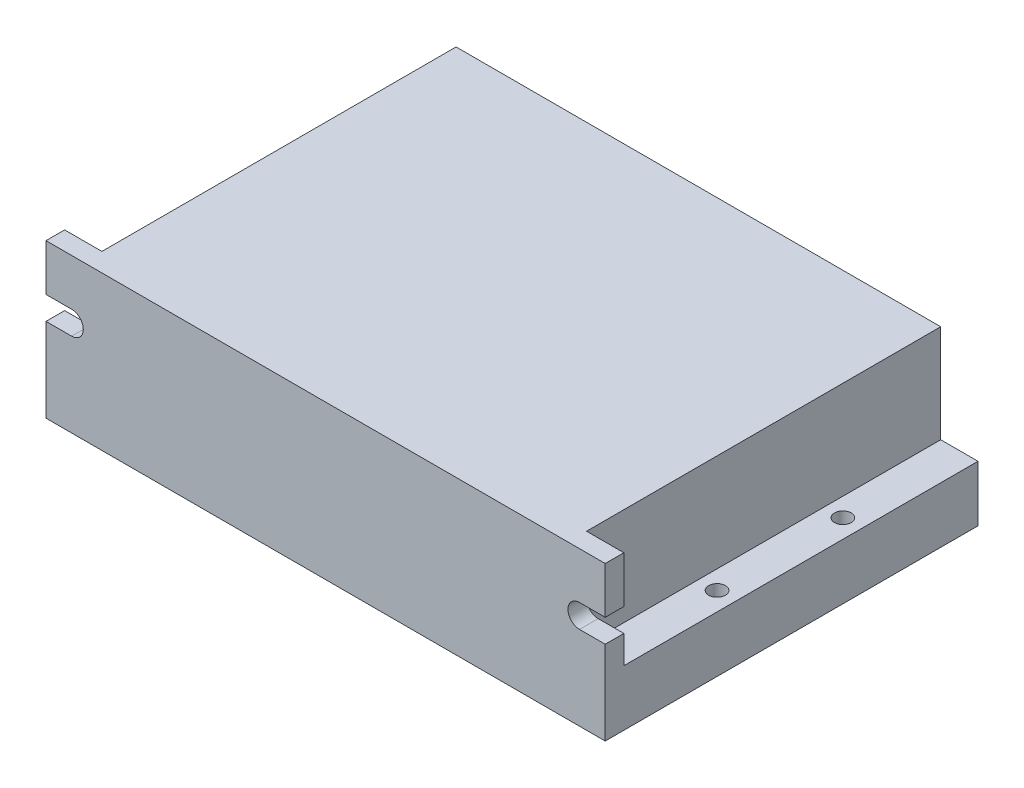
ISO-10303-21;
HEADER;
FILE_DESCRIPTION(('STEP AP214'),'2;1');
FILE_NAME('part.step','',(''),(''),'','','');
FILE_SCHEMA(('AUTOMOTIVE_DESIGN { 1 0 10303 214 1 1 1 1 }'));
ENDSEC;
DATA;
#1=APPLICATION_CONTEXT('core data for automotive mechanical design processes');
#2=APPLICATION_PROTOCOL_DEFINITION('international standard','automotive_design',2000,#1);
#3=PRODUCT_CONTEXT('',#1,'mechanical');
#4=PRODUCT('Part','Part','',(#3));
#5=PRODUCT_RELATED_PRODUCT_CATEGORY('part','',(#4));
#6=PRODUCT_DEFINITION_FORMATION('','',#4);
#7=PRODUCT_DEFINITION_CONTEXT('part definition',#1,'design');
#8=PRODUCT_DEFINITION('design','',#6,#7);
#9=PRODUCT_DEFINITION_SHAPE('','',#8);
#10=(LENGTH_UNIT() NAMED_UNIT(*) SI_UNIT(.MILLI.,.METRE.));
#11=(NAMED_UNIT(*) PLANE_ANGLE_UNIT() SI_UNIT($,.RADIAN.));
#12=(NAMED_UNIT(*) SI_UNIT($,.STERADIAN.) SOLID_ANGLE_UNIT());
#13=UNCERTAINTY_MEASURE_WITH_UNIT(LENGTH_MEASURE(1.E-05),#10,'distance_accuracy_value','');
#14=(GEOMETRIC_REPRESENTATION_CONTEXT(3) GLOBAL_UNCERTAINTY_ASSIGNED_CONTEXT((#13)) GLOBAL_UNIT_ASSIGNED_CONTEXT((#10,
#11,#12)) REPRESENTATION_CONTEXT('',''));
#15=CARTESIAN_POINT('',(0.,0.,0.));
#16=DIRECTION('',(0.,0.,1.));
#17=DIRECTION('',(1.,0.,0.));
#18=AXIS2_PLACEMENT_3D('',#15,#16,#17);
#19=CARTESIAN_POINT('',(60.,33.,-40.));
#20=DIRECTION('',(-1.,0.,0.));
#21=DIRECTION('',(0.,0.,1.));
#22=AXIS2_PLACEMENT_3D('',#19,#20,#21);
#23=PLANE('',#22);
#24=DIRECTION('',(0.,0.,1.));
#25=VECTOR('',#24,1.);
#26=CARTESIAN_POINT('',(60.,18.,-40.));
#27=LINE('',#26,#25);
#28=CARTESIAN_POINT('',(60.,18.,36.));
#29=VERTEX_POINT('',#28);
#30=CARTESIAN_POINT('',(60.,18.,40.));
#31=VERTEX_POINT('',#30);
#32=EDGE_CURVE('E49',#29,#31,#27,.T.);
#33=ORIENTED_EDGE('',*,*,#32,.T.);
#34=DIRECTION('',(0.,-1.,0.));
#35=VECTOR('',#34,1.);
#36=CARTESIAN_POINT('',(60.,33.,40.));
#37=LINE('',#36,#35);
#38=CARTESIAN_POINT('',(60.,0.,40.));
#39=VERTEX_POINT('',#38);
#40=EDGE_CURVE('E186',#31,#39,#37,.T.);
#41=ORIENTED_EDGE('',*,*,#40,.T.);
#42=DIRECTION('',(0.,0.,-1.));
#43=VECTOR('',#42,1.);
#44=CARTESIAN_POINT('',(60.,0.,-40.));
#45=LINE('',#44,#43);
#46=CARTESIAN_POINT('',(60.,0.,-40.));
#47=VERTEX_POINT('',#46);
#48=EDGE_CURVE('E289',#39,#47,#45,.T.);
#49=ORIENTED_EDGE('',*,*,#48,.T.);
#50=DIRECTION('',(0.,-1.,0.));
#51=VECTOR('',#50,1.);
#52=CARTESIAN_POINT('',(60.,33.,-40.));
#53=LINE('',#52,#51);
#54=CARTESIAN_POINT('',(60.,12.,-40.));
#55=VERTEX_POINT('',#54);
#56=EDGE_CURVE('E318',#55,#47,#53,.T.);
#57=ORIENTED_EDGE('',*,*,#56,.F.);
#58=DIRECTION('',(0.,0.,-1.));
#59=VECTOR('',#58,1.);
#60=CARTESIAN_POINT('',(60.,12.,-40.));
#61=LINE('',#60,#59);
#62=CARTESIAN_POINT('',(60.,12.,36.));
#63=VERTEX_POINT('',#62);
#64=EDGE_CURVE('E214',#63,#55,#61,.T.);
#65=ORIENTED_EDGE('',*,*,#64,.F.);
#66=DIRECTION('',(0.,1.,0.));
#67=VECTOR('',#66,1.);
#68=CARTESIAN_POINT('',(60.,-76.4198926981712,36.));
#69=LINE('',#68,#67);
#70=EDGE_CURVE('E223',#63,#29,#69,.T.);
#71=ORIENTED_EDGE('',*,*,#70,.T.);
#72=EDGE_LOOP('',(#33,#41,#49,#57,#65,#71));
#73=FACE_BOUND('',#72,.T.);
#74=ADVANCED_FACE('F34',(#73),#23,.F.);
#75=CARTESIAN_POINT('',(60.,-76.4198926981712,36.));
#76=DIRECTION('',(0.,0.,-1.));
#77=DIRECTION('',(-1.,0.,0.));
#78=AXIS2_PLACEMENT_3D('',#75,#76,#77);
#79=PLANE('',#78);
#80=DIRECTION('',(0.,1.,0.));
#81=VECTOR('',#80,1.);
#82=CARTESIAN_POINT('',(52.,-76.4198926981712,36.));
#83=LINE('',#82,#81);
#84=CARTESIAN_POINT('',(52.,12.,36.));
#85=VERTEX_POINT('',#84);
#86=CARTESIAN_POINT('',(52.,20.5,36.));
#87=VERTEX_POINT('',#86);
#88=EDGE_CURVE('E227',#85,#87,#83,.T.);
#89=ORIENTED_EDGE('',*,*,#88,.T.);
#90=CARTESIAN_POINT('',(54.5,20.5,36.));
#91=DIRECTION('',(0.,0.,-1.));
#92=DIRECTION('',(-1.,0.,0.));
#93=AXIS2_PLACEMENT_3D('',#90,#91,#92);
#94=CIRCLE('',#93,2.5);
#95=CARTESIAN_POINT('',(54.5,18.,36.));
#96=VERTEX_POINT('',#95);
#97=EDGE_CURVE('E329',#87,#96,#94,.F.);
#98=ORIENTED_EDGE('',*,*,#97,.T.);
#99=DIRECTION('',(1.,0.,0.));
#100=VECTOR('',#99,1.);
#101=CARTESIAN_POINT('',(60.0000000000001,18.,36.));
#102=LINE('',#101,#100);
#103=EDGE_CURVE('E169',#96,#29,#102,.T.);
#104=ORIENTED_EDGE('',*,*,#103,.T.);
#105=ORIENTED_EDGE('',*,*,#70,.F.);
#106=DIRECTION('',(1.,0.,0.));
#107=VECTOR('',#106,1.);
#108=CARTESIAN_POINT('',(60.,12.,36.));
#109=LINE('',#108,#107);
#110=EDGE_CURVE('E210',#85,#63,#109,.T.);
#111=ORIENTED_EDGE('',*,*,#110,.F.);
#112=EDGE_LOOP('',(#89,#98,#104,#105,#111));
#113=FACE_BOUND('',#112,.T.);
#114=ADVANCED_FACE('F337',(#113),#79,.T.);
#115=CARTESIAN_POINT('',(60.,33.,40.));
#116=VERTEX_POINT('',#115);
#117=CARTESIAN_POINT('',(60.,23.,40.));
#118=VERTEX_POINT('',#117);
#119=EDGE_CURVE('E309',#116,#118,#37,.T.);
#120=ORIENTED_EDGE('',*,*,#119,.T.);
#121=DIRECTION('',(0.,0.,1.));
#122=VECTOR('',#121,1.);
#123=CARTESIAN_POINT('',(60.,23.,-40.));
#124=LINE('',#123,#122);
#125=CARTESIAN_POINT('',(60.,23.,36.));
#126=VERTEX_POINT('',#125);
#127=EDGE_CURVE('E192',#126,#118,#124,.T.);
#128=ORIENTED_EDGE('',*,*,#127,.F.);
#129=CARTESIAN_POINT('',(60.,33.,36.));
#130=VERTEX_POINT('',#129);
#131=EDGE_CURVE('E226',#126,#130,#69,.T.);
#132=ORIENTED_EDGE('',*,*,#131,.T.);
#133=DIRECTION('',(0.,0.,-1.));
#134=VECTOR('',#133,1.);
#135=CARTESIAN_POINT('',(60.,33.,-40.));
#136=LINE('',#135,#134);
#137=EDGE_CURVE('E290',#116,#130,#136,.T.);
#138=ORIENTED_EDGE('',*,*,#137,.F.);
#139=EDGE_LOOP('',(#120,#128,#132,#138));
#140=FACE_BOUND('',#139,.T.);
#141=ADVANCED_FACE('F36',(#140),#23,.F.);
#142=CARTESIAN_POINT('',(-60.,33.,-40.));
#143=DIRECTION('',(0.,0.,1.));
#144=DIRECTION('',(1.,0.,0.));
#145=AXIS2_PLACEMENT_3D('',#142,#143,#144);
#146=PLANE('',#145);
#147=DIRECTION('',(0.,1.,0.));
#148=VECTOR('',#147,1.);
#149=CARTESIAN_POINT('',(52.,-76.4198926981712,-40.));
#150=LINE('',#149,#148);
#151=CARTESIAN_POINT('',(52.,12.,-40.));
#152=VERTEX_POINT('',#151);
#153=CARTESIAN_POINT('',(52.,33.,-40.));
#154=VERTEX_POINT('',#153);
#155=EDGE_CURVE('E222',#152,#154,#150,.T.);
#156=ORIENTED_EDGE('',*,*,#155,.F.);
#157=DIRECTION('',(-1.,0.,0.));
#158=VECTOR('',#157,1.);
#159=CARTESIAN_POINT('',(60.,12.,-40.));
#160=LINE('',#159,#158);
#161=EDGE_CURVE('E211',#55,#152,#160,.T.);
#162=ORIENTED_EDGE('',*,*,#161,.F.);
#163=ORIENTED_EDGE('',*,*,#56,.T.);
#164=DIRECTION('',(-1.,0.,0.));
#165=VECTOR('',#164,1.);
#166=CARTESIAN_POINT('',(-60.,0.,-40.));
#167=LINE('',#166,#165);
#168=CARTESIAN_POINT('',(-60.,0.,-40.));
#169=VERTEX_POINT('',#168);
#170=EDGE_CURVE('E302',#47,#169,#167,.T.);
#171=ORIENTED_EDGE('',*,*,#170,.T.);
#172=DIRECTION('',(0.,-1.,0.));
#173=VECTOR('',#172,1.);
#174=CARTESIAN_POINT('',(-60.,33.,-40.));
#175=LINE('',#174,#173);
#176=CARTESIAN_POINT('',(-60.,12.,-40.));
#177=VERTEX_POINT('',#176);
#178=EDGE_CURVE('E316',#177,#169,#175,.T.);
#179=ORIENTED_EDGE('',*,*,#178,.F.);
#180=DIRECTION('',(1.,0.,0.));
#181=VECTOR('',#180,1.);
#182=CARTESIAN_POINT('',(-60.,12.,-40.));
#183=LINE('',#182,#181);
#184=CARTESIAN_POINT('',(-52.,12.,-40.));
#185=VERTEX_POINT('',#184);
#186=EDGE_CURVE('E265',#177,#185,#183,.T.);
#187=ORIENTED_EDGE('',*,*,#186,.T.);
#188=DIRECTION('',(0.,1.,0.));
#189=VECTOR('',#188,1.);
#190=CARTESIAN_POINT('',(-52.,-76.4198926981712,-40.));
#191=LINE('',#190,#189);
#192=CARTESIAN_POINT('',(-52.,33.,-40.));
#193=VERTEX_POINT('',#192);
#194=EDGE_CURVE('E266',#185,#193,#191,.T.);
#195=ORIENTED_EDGE('',*,*,#194,.T.);
#196=DIRECTION('',(-1.,0.,0.));
#197=VECTOR('',#196,1.);
#198=CARTESIAN_POINT('',(-60.,33.,-40.));
#199=LINE('',#198,#197);
#200=EDGE_CURVE('E293',#154,#193,#199,.T.);
#201=ORIENTED_EDGE('',*,*,#200,.F.);
#202=EDGE_LOOP('',(#156,#162,#163,#171,#179,#187,#195,#201));
#203=FACE_BOUND('',#202,.T.);
#204=ADVANCED_FACE('F348',(#203),#146,.F.);
#205=CARTESIAN_POINT('',(0.,33.,0.));
#206=DIRECTION('',(0.,1.,0.));
#207=DIRECTION('',(0.,0.,1.));
#208=AXIS2_PLACEMENT_3D('',#205,#206,#207);
#209=PLANE('',#208);
#210=DIRECTION('',(-1.,0.,0.));
#211=VECTOR('',#210,1.);
#212=CARTESIAN_POINT('',(60.,33.,36.));
#213=LINE('',#212,#211);
#214=CARTESIAN_POINT('',(52.,33.,36.));
#215=VERTEX_POINT('',#214);
#216=EDGE_CURVE('E219',#130,#215,#213,.T.);
#217=ORIENTED_EDGE('',*,*,#216,.T.);
#218=DIRECTION('',(0.,0.,-1.));
#219=VECTOR('',#218,1.);
#220=CARTESIAN_POINT('',(52.,33.,-40.));
#221=LINE('',#220,#219);
#222=EDGE_CURVE('E204',#215,#154,#221,.T.);
#223=ORIENTED_EDGE('',*,*,#222,.T.);
#224=ORIENTED_EDGE('',*,*,#200,.T.);
#225=DIRECTION('',(0.,0.,-1.));
#226=VECTOR('',#225,1.);
#227=CARTESIAN_POINT('',(-52.,33.,-40.));
#228=LINE('',#227,#226);
#229=CARTESIAN_POINT('',(-52.,33.,36.));
#230=VERTEX_POINT('',#229);
#231=EDGE_CURVE('E275',#230,#193,#228,.T.);
#232=ORIENTED_EDGE('',*,*,#231,.F.);
#233=DIRECTION('',(1.,0.,0.));
#234=VECTOR('',#233,1.);
#235=CARTESIAN_POINT('',(-60.,33.,36.));
#236=LINE('',#235,#234);
#237=CARTESIAN_POINT('',(-60.,33.,36.));
#238=VERTEX_POINT('',#237);
#239=EDGE_CURVE('E260',#238,#230,#236,.T.);
#240=ORIENTED_EDGE('',*,*,#239,.F.);
#241=DIRECTION('',(0.,0.,1.));
#242=VECTOR('',#241,1.);
#243=CARTESIAN_POINT('',(-60.,33.,-40.));
#244=LINE('',#243,#242);
#245=CARTESIAN_POINT('',(-60.,33.,40.));
#246=VERTEX_POINT('',#245);
#247=EDGE_CURVE('E296',#238,#246,#244,.T.);
#248=ORIENTED_EDGE('',*,*,#247,.T.);
#249=DIRECTION('',(1.,0.,0.));
#250=VECTOR('',#249,1.);
#251=CARTESIAN_POINT('',(-60.,33.,40.));
#252=LINE('',#251,#250);
#253=EDGE_CURVE('E298',#246,#116,#252,.T.);
#254=ORIENTED_EDGE('',*,*,#253,.T.);
#255=ORIENTED_EDGE('',*,*,#137,.T.);
#256=EDGE_LOOP('',(#217,#223,#224,#232,#240,#248,#254,#255));
#257=FACE_BOUND('',#256,.T.);
#258=ADVANCED_FACE('F372',(#257),#209,.T.);
#259=CARTESIAN_POINT('',(-60.,33.,-40.));
#260=DIRECTION('',(1.,0.,0.));
#261=DIRECTION('',(0.,0.,-1.));
#262=AXIS2_PLACEMENT_3D('',#259,#260,#261);
#263=PLANE('',#262);
#264=DIRECTION('',(0.,0.,1.));
#265=VECTOR('',#264,1.);
#266=CARTESIAN_POINT('',(-60.,23.,-40.));
#267=LINE('',#266,#265);
#268=CARTESIAN_POINT('',(-60.,23.,36.));
#269=VERTEX_POINT('',#268);
#270=CARTESIAN_POINT('',(-60.,23.,40.));
#271=VERTEX_POINT('',#270);
#272=EDGE_CURVE('E247',#269,#271,#267,.T.);
#273=ORIENTED_EDGE('',*,*,#272,.T.);
#274=DIRECTION('',(0.,-1.,0.));
#275=VECTOR('',#274,1.);
#276=CARTESIAN_POINT('',(-60.,33.,40.));
#277=LINE('',#276,#275);
#278=EDGE_CURVE('E313',#246,#271,#277,.T.);
#279=ORIENTED_EDGE('',*,*,#278,.F.);
#280=ORIENTED_EDGE('',*,*,#247,.F.);
#281=DIRECTION('',(0.,1.,0.));
#282=VECTOR('',#281,1.);
#283=CARTESIAN_POINT('',(-60.,-76.4198926981712,36.));
#284=LINE('',#283,#282);
#285=EDGE_CURVE('E278',#269,#238,#284,.T.);
#286=ORIENTED_EDGE('',*,*,#285,.F.);
#287=EDGE_LOOP('',(#273,#279,#280,#286));
#288=FACE_BOUND('',#287,.T.);
#289=ADVANCED_FACE('F384',(#288),#263,.F.);
#290=CARTESIAN_POINT('',(-60.,-76.4198926981712,36.));
#291=DIRECTION('',(0.,0.,1.));
#292=DIRECTION('',(1.,0.,0.));
#293=AXIS2_PLACEMENT_3D('',#290,#291,#292);
#294=PLANE('',#293);
#295=CARTESIAN_POINT('',(-60.,12.,36.));
#296=VERTEX_POINT('',#295);
#297=CARTESIAN_POINT('',(-60.,18.,36.));
#298=VERTEX_POINT('',#297);
#299=EDGE_CURVE('E285',#296,#298,#284,.T.);
#300=ORIENTED_EDGE('',*,*,#299,.T.);
#301=DIRECTION('',(1.,0.,0.));
#302=VECTOR('',#301,1.);
#303=CARTESIAN_POINT('',(-60.0000000000001,18.,36.));
#304=LINE('',#303,#302);
#305=CARTESIAN_POINT('',(-54.5,18.,36.));
#306=VERTEX_POINT('',#305);
#307=EDGE_CURVE('E326',#298,#306,#304,.T.);
#308=ORIENTED_EDGE('',*,*,#307,.T.);
#309=CARTESIAN_POINT('',(-54.5,20.5,36.));
#310=DIRECTION('',(0.,0.,1.));
#311=DIRECTION('',(1.,0.,0.));
#312=AXIS2_PLACEMENT_3D('',#309,#310,#311);
#313=CIRCLE('',#312,2.5);
#314=CARTESIAN_POINT('',(-52.,20.5,36.));
#315=VERTEX_POINT('',#314);
#316=EDGE_CURVE('E325',#306,#315,#313,.T.);
#317=ORIENTED_EDGE('',*,*,#316,.T.);
#318=DIRECTION('',(0.,1.,0.));
#319=VECTOR('',#318,1.);
#320=CARTESIAN_POINT('',(-52.,-76.4198926981712,36.));
#321=LINE('',#320,#319);
#322=CARTESIAN_POINT('',(-52.,12.,36.));
#323=VERTEX_POINT('',#322);
#324=EDGE_CURVE('E281',#323,#315,#321,.T.);
#325=ORIENTED_EDGE('',*,*,#324,.F.);
#326=DIRECTION('',(-1.,0.,0.));
#327=VECTOR('',#326,1.);
#328=CARTESIAN_POINT('',(-60.,12.,36.));
#329=LINE('',#328,#327);
#330=EDGE_CURVE('E272',#323,#296,#329,.T.);
#331=ORIENTED_EDGE('',*,*,#330,.T.);
#332=EDGE_LOOP('',(#300,#308,#317,#325,#331));
#333=FACE_BOUND('',#332,.T.);
#334=ADVANCED_FACE('F396',(#333),#294,.F.);
#335=CARTESIAN_POINT('',(-60.,18.,40.));
#336=VERTEX_POINT('',#335);
#337=CARTESIAN_POINT('',(-60.,0.,40.));
#338=VERTEX_POINT('',#337);
#339=EDGE_CURVE('E312',#336,#338,#277,.T.);
#340=ORIENTED_EDGE('',*,*,#339,.F.);
#341=DIRECTION('',(0.,0.,1.));
#342=VECTOR('',#341,1.);
#343=CARTESIAN_POINT('',(-60.,18.,-40.));
#344=LINE('',#343,#342);
#345=EDGE_CURVE('E245',#298,#336,#344,.T.);
#346=ORIENTED_EDGE('',*,*,#345,.F.);
#347=ORIENTED_EDGE('',*,*,#299,.F.);
#348=DIRECTION('',(0.,0.,-1.));
#349=VECTOR('',#348,1.);
#350=CARTESIAN_POINT('',(-60.,12.,-40.));
#351=LINE('',#350,#349);
#352=EDGE_CURVE('E269',#296,#177,#351,.T.);
#353=ORIENTED_EDGE('',*,*,#352,.T.);
#354=ORIENTED_EDGE('',*,*,#178,.T.);
#355=DIRECTION('',(0.,0.,1.));
#356=VECTOR('',#355,1.);
#357=CARTESIAN_POINT('',(-60.,0.,-40.));
#358=LINE('',#357,#356);
#359=EDGE_CURVE('E305',#169,#338,#358,.T.);
#360=ORIENTED_EDGE('',*,*,#359,.T.);
#361=EDGE_LOOP('',(#340,#346,#347,#353,#354,#360));
#362=FACE_BOUND('',#361,.T.);
#363=ADVANCED_FACE('F356',(#362),#263,.F.);
#364=CARTESIAN_POINT('',(-60.,33.,40.));
#365=DIRECTION('',(0.,0.,-1.));
#366=DIRECTION('',(-1.,0.,0.));
#367=AXIS2_PLACEMENT_3D('',#364,#365,#366);
#368=PLANE('',#367);
#369=CARTESIAN_POINT('',(54.5,20.5,40.));
#370=DIRECTION('',(0.,0.,-1.));
#371=DIRECTION('',(-1.,0.,0.));
#372=AXIS2_PLACEMENT_3D('',#369,#370,#371);
#373=CIRCLE('',#372,2.5);
#374=CARTESIAN_POINT('',(54.5,18.,40.));
#375=VERTEX_POINT('',#374);
#376=CARTESIAN_POINT('',(54.5,23.,40.));
#377=VERTEX_POINT('',#376);
#378=EDGE_CURVE('E175',#375,#377,#373,.T.);
#379=ORIENTED_EDGE('',*,*,#378,.T.);
#380=DIRECTION('',(-1.,0.,0.));
#381=VECTOR('',#380,1.);
#382=CARTESIAN_POINT('',(0.,23.,40.));
#383=LINE('',#382,#381);
#384=EDGE_CURVE('E172',#118,#377,#383,.T.);
#385=ORIENTED_EDGE('',*,*,#384,.F.);
#386=ORIENTED_EDGE('',*,*,#119,.F.);
#387=ORIENTED_EDGE('',*,*,#253,.F.);
#388=ORIENTED_EDGE('',*,*,#278,.T.);
#389=DIRECTION('',(1.,0.,0.));
#390=VECTOR('',#389,1.);
#391=CARTESIAN_POINT('',(0.,23.,40.));
#392=LINE('',#391,#390);
#393=CARTESIAN_POINT('',(-54.5,23.,40.));
#394=VERTEX_POINT('',#393);
#395=EDGE_CURVE('E235',#271,#394,#392,.T.);
#396=ORIENTED_EDGE('',*,*,#395,.T.);
#397=CARTESIAN_POINT('',(-54.5,20.5,40.));
#398=DIRECTION('',(0.,0.,1.));
#399=DIRECTION('',(1.,0.,0.));
#400=AXIS2_PLACEMENT_3D('',#397,#398,#399);
#401=CIRCLE('',#400,2.5);
#402=CARTESIAN_POINT('',(-54.5,18.,40.));
#403=VERTEX_POINT('',#402);
#404=EDGE_CURVE('E216',#403,#394,#401,.T.);
#405=ORIENTED_EDGE('',*,*,#404,.F.);
#406=DIRECTION('',(1.,0.,0.));
#407=VECTOR('',#406,1.);
#408=CARTESIAN_POINT('',(0.,18.,40.));
#409=LINE('',#408,#407);
#410=EDGE_CURVE('E238',#336,#403,#409,.T.);
#411=ORIENTED_EDGE('',*,*,#410,.F.);
#412=ORIENTED_EDGE('',*,*,#339,.T.);
#413=DIRECTION('',(1.,0.,0.));
#414=VECTOR('',#413,1.);
#415=CARTESIAN_POINT('',(-60.,0.,40.));
#416=LINE('',#415,#414);
#417=EDGE_CURVE('E294',#338,#39,#416,.T.);
#418=ORIENTED_EDGE('',*,*,#417,.T.);
#419=ORIENTED_EDGE('',*,*,#40,.F.);
#420=DIRECTION('',(-1.,0.,0.));
#421=VECTOR('',#420,1.);
#422=CARTESIAN_POINT('',(0.,18.,40.));
#423=LINE('',#422,#421);
#424=EDGE_CURVE('E168',#31,#375,#423,.T.);
#425=ORIENTED_EDGE('',*,*,#424,.T.);
#426=EDGE_LOOP('',(#379,#385,#386,#387,#388,#396,#405,#411,#412,#418,#419,#425));
#427=FACE_BOUND('',#426,.T.);
#428=ADVANCED_FACE('F184',(#427),#368,.F.);
#429=CARTESIAN_POINT('',(0.,0.,0.));
#430=DIRECTION('',(0.,1.,0.));
#431=DIRECTION('',(0.,0.,1.));
#432=AXIS2_PLACEMENT_3D('',#429,#430,#431);
#433=PLANE('',#432);
#434=CARTESIAN_POINT('',(56.,0.,12.));
#435=DIRECTION('',(0.,-1.,0.));
#436=DIRECTION('',(0.,0.,1.));
#437=AXIS2_PLACEMENT_3D('',#434,#435,#436);
#438=CIRCLE('',#437,1.8);
#439=CARTESIAN_POINT('',(56.,0.,13.8));
#440=VERTEX_POINT('',#439);
#441=EDGE_CURVE('E195',#440,#440,#438,.T.);
#442=ORIENTED_EDGE('',*,*,#441,.F.);
#443=EDGE_LOOP('',(#442));
#444=FACE_BOUND('',#443,.T.);
#445=CARTESIAN_POINT('',(56.,0.,-15.));
#446=DIRECTION('',(0.,-1.,0.));
#447=DIRECTION('',(0.,0.,1.));
#448=AXIS2_PLACEMENT_3D('',#445,#446,#447);
#449=CIRCLE('',#448,1.8);
#450=CARTESIAN_POINT('',(56.,0.,-13.2));
#451=VERTEX_POINT('',#450);
#452=EDGE_CURVE('E201',#451,#451,#449,.T.);
#453=ORIENTED_EDGE('',*,*,#452,.F.);
#454=EDGE_LOOP('',(#453));
#455=FACE_BOUND('',#454,.T.);
#456=CARTESIAN_POINT('',(-56.,0.,12.));
#457=DIRECTION('',(0.,1.,0.));
#458=DIRECTION('',(0.,0.,1.));
#459=AXIS2_PLACEMENT_3D('',#456,#457,#458);
#460=CIRCLE('',#459,1.8);
#461=CARTESIAN_POINT('',(-56.,0.,13.8));
#462=VERTEX_POINT('',#461);
#463=EDGE_CURVE('E251',#462,#462,#460,.T.);
#464=ORIENTED_EDGE('',*,*,#463,.T.);
#465=EDGE_LOOP('',(#464));
#466=FACE_BOUND('',#465,.T.);
#467=CARTESIAN_POINT('',(-56.,0.,-15.));
#468=DIRECTION('',(0.,1.,0.));
#469=DIRECTION('',(0.,0.,1.));
#470=AXIS2_PLACEMENT_3D('',#467,#468,#469);
#471=CIRCLE('',#470,1.8);
#472=CARTESIAN_POINT('',(-56.,0.,-13.2));
#473=VERTEX_POINT('',#472);
#474=EDGE_CURVE('E257',#473,#473,#471,.T.);
#475=ORIENTED_EDGE('',*,*,#474,.T.);
#476=EDGE_LOOP('',(#475));
#477=FACE_BOUND('',#476,.T.);
#478=ORIENTED_EDGE('',*,*,#48,.F.);
#479=ORIENTED_EDGE('',*,*,#417,.F.);
#480=ORIENTED_EDGE('',*,*,#359,.F.);
#481=ORIENTED_EDGE('',*,*,#170,.F.);
#482=EDGE_LOOP('',(#478,#479,#480,#481));
#483=FACE_BOUND('',#482,.T.);
#484=ADVANCED_FACE('F352',(#444,#455,#466,#477,#483),#433,.F.);
#485=CARTESIAN_POINT('',(-52.,-76.4198926981712,-40.));
#486=DIRECTION('',(1.,0.,0.));
#487=DIRECTION('',(0.,0.,-1.));
#488=AXIS2_PLACEMENT_3D('',#485,#486,#487);
#489=PLANE('',#488);
#490=ORIENTED_EDGE('',*,*,#231,.T.);
#491=ORIENTED_EDGE('',*,*,#194,.F.);
#492=DIRECTION('',(0.,0.,1.));
#493=VECTOR('',#492,1.);
#494=CARTESIAN_POINT('',(-52.,12.,-40.));
#495=LINE('',#494,#493);
#496=EDGE_CURVE('E263',#185,#323,#495,.T.);
#497=ORIENTED_EDGE('',*,*,#496,.T.);
#498=ORIENTED_EDGE('',*,*,#324,.T.);
#499=EDGE_CURVE('E284',#315,#230,#321,.T.);
#500=ORIENTED_EDGE('',*,*,#499,.T.);
#501=EDGE_LOOP('',(#490,#491,#497,#498,#500));
#502=FACE_BOUND('',#501,.T.);
#503=ADVANCED_FACE('F367',(#502),#489,.F.);
#504=ORIENTED_EDGE('',*,*,#499,.F.);
#505=CARTESIAN_POINT('',(-54.5,23.,36.));
#506=VERTEX_POINT('',#505);
#507=EDGE_CURVE('E322',#315,#506,#313,.T.);
#508=ORIENTED_EDGE('',*,*,#507,.T.);
#509=DIRECTION('',(1.,0.,0.));
#510=VECTOR('',#509,1.);
#511=CARTESIAN_POINT('',(-60.,23.,36.));
#512=LINE('',#511,#510);
#513=EDGE_CURVE('E320',#269,#506,#512,.T.);
#514=ORIENTED_EDGE('',*,*,#513,.F.);
#515=ORIENTED_EDGE('',*,*,#285,.T.);
#516=ORIENTED_EDGE('',*,*,#239,.T.);
#517=EDGE_LOOP('',(#504,#508,#514,#515,#516));
#518=FACE_BOUND('',#517,.T.);
#519=ADVANCED_FACE('F390',(#518),#294,.F.);
#520=CARTESIAN_POINT('',(0.,12.,0.));
#521=DIRECTION('',(0.,1.,0.));
#522=DIRECTION('',(0.,0.,1.));
#523=AXIS2_PLACEMENT_3D('',#520,#521,#522);
#524=PLANE('',#523);
#525=CARTESIAN_POINT('',(-56.,12.,12.));
#526=DIRECTION('',(0.,1.,0.));
#527=DIRECTION('',(0.,0.,1.));
#528=AXIS2_PLACEMENT_3D('',#525,#526,#527);
#529=CIRCLE('',#528,1.8);
#530=CARTESIAN_POINT('',(-56.,12.,13.8));
#531=VERTEX_POINT('',#530);
#532=EDGE_CURVE('E244',#531,#531,#529,.T.);
#533=ORIENTED_EDGE('',*,*,#532,.F.);
#534=EDGE_LOOP('',(#533));
#535=FACE_BOUND('',#534,.T.);
#536=CARTESIAN_POINT('',(-56.,12.,-15.));
#537=DIRECTION('',(0.,1.,0.));
#538=DIRECTION('',(0.,0.,1.));
#539=AXIS2_PLACEMENT_3D('',#536,#537,#538);
#540=CIRCLE('',#539,1.8);
#541=CARTESIAN_POINT('',(-56.,12.,-13.2));
#542=VERTEX_POINT('',#541);
#543=EDGE_CURVE('E254',#542,#542,#540,.T.);
#544=ORIENTED_EDGE('',*,*,#543,.F.);
#545=EDGE_LOOP('',(#544));
#546=FACE_BOUND('',#545,.T.);
#547=ORIENTED_EDGE('',*,*,#352,.F.);
#548=ORIENTED_EDGE('',*,*,#330,.F.);
#549=ORIENTED_EDGE('',*,*,#496,.F.);
#550=ORIENTED_EDGE('',*,*,#186,.F.);
#551=EDGE_LOOP('',(#547,#548,#549,#550));
#552=FACE_BOUND('',#551,.T.);
#553=ADVANCED_FACE('F363',(#535,#546,#552),#524,.T.);
#554=CARTESIAN_POINT('',(-56.,0.,-15.));
#555=DIRECTION('',(0.,1.,0.));
#556=DIRECTION('',(0.,0.,1.));
#557=AXIS2_PLACEMENT_3D('',#554,#555,#556);
#558=CYLINDRICAL_SURFACE('',#557,1.8);
#559=ORIENTED_EDGE('',*,*,#474,.F.);
#560=EDGE_LOOP('',(#559));
#561=FACE_BOUND('',#560,.T.);
#562=ORIENTED_EDGE('',*,*,#543,.T.);
#563=EDGE_LOOP('',(#562));
#564=FACE_BOUND('',#563,.T.);
#565=ADVANCED_FACE('F438',(#561,#564),#558,.F.);
#566=CARTESIAN_POINT('',(-56.,0.,12.));
#567=DIRECTION('',(0.,1.,0.));
#568=DIRECTION('',(0.,0.,1.));
#569=AXIS2_PLACEMENT_3D('',#566,#567,#568);
#570=CYLINDRICAL_SURFACE('',#569,1.8);
#571=ORIENTED_EDGE('',*,*,#463,.F.);
#572=EDGE_LOOP('',(#571));
#573=FACE_BOUND('',#572,.T.);
#574=ORIENTED_EDGE('',*,*,#532,.T.);
#575=EDGE_LOOP('',(#574));
#576=FACE_BOUND('',#575,.T.);
#577=ADVANCED_FACE('F408',(#573,#576),#570,.F.);
#578=CARTESIAN_POINT('',(-54.5,20.5,-40.));
#579=DIRECTION('',(0.,0.,1.));
#580=DIRECTION('',(1.,0.,0.));
#581=AXIS2_PLACEMENT_3D('',#578,#579,#580);
#582=CYLINDRICAL_SURFACE('',#581,2.5);
#583=DIRECTION('',(0.,0.,1.));
#584=VECTOR('',#583,1.);
#585=CARTESIAN_POINT('',(-54.5,18.,-40.));
#586=LINE('',#585,#584);
#587=EDGE_CURVE('E242',#306,#403,#586,.T.);
#588=ORIENTED_EDGE('',*,*,#587,.T.);
#589=ORIENTED_EDGE('',*,*,#404,.T.);
#590=DIRECTION('',(0.,0.,1.));
#591=VECTOR('',#590,1.);
#592=CARTESIAN_POINT('',(-54.5,23.,-40.));
#593=LINE('',#592,#591);
#594=EDGE_CURVE('E241',#506,#394,#593,.T.);
#595=ORIENTED_EDGE('',*,*,#594,.F.);
#596=ORIENTED_EDGE('',*,*,#507,.F.);
#597=ORIENTED_EDGE('',*,*,#316,.F.);
#598=EDGE_LOOP('',(#588,#589,#595,#596,#597));
#599=FACE_BOUND('',#598,.T.);
#600=ADVANCED_FACE('F393',(#599),#582,.F.);
#601=CARTESIAN_POINT('',(0.,18.,-40.));
#602=DIRECTION('',(0.,-1.,0.));
#603=DIRECTION('',(1.,0.,0.));
#604=AXIS2_PLACEMENT_3D('',#601,#602,#603);
#605=PLANE('',#604);
#606=ORIENTED_EDGE('',*,*,#345,.T.);
#607=ORIENTED_EDGE('',*,*,#410,.T.);
#608=ORIENTED_EDGE('',*,*,#587,.F.);
#609=ORIENTED_EDGE('',*,*,#307,.F.);
#610=EDGE_LOOP('',(#606,#607,#608,#609));
#611=FACE_BOUND('',#610,.T.);
#612=ADVANCED_FACE('F398',(#611),#605,.F.);
#613=CARTESIAN_POINT('',(0.,23.,-40.));
#614=DIRECTION('',(0.,-1.,0.));
#615=DIRECTION('',(0.,0.,-1.));
#616=AXIS2_PLACEMENT_3D('',#613,#614,#615);
#617=PLANE('',#616);
#618=ORIENTED_EDGE('',*,*,#513,.T.);
#619=ORIENTED_EDGE('',*,*,#594,.T.);
#620=ORIENTED_EDGE('',*,*,#395,.F.);
#621=ORIENTED_EDGE('',*,*,#272,.F.);
#622=EDGE_LOOP('',(#618,#619,#620,#621));
#623=FACE_BOUND('',#622,.T.);
#624=ADVANCED_FACE('F387',(#623),#617,.T.);
#625=CARTESIAN_POINT('',(52.,-76.4198926981712,-40.));
#626=DIRECTION('',(1.,0.,0.));
#627=DIRECTION('',(0.,0.,-1.));
#628=AXIS2_PLACEMENT_3D('',#625,#626,#627);
#629=PLANE('',#628);
#630=ORIENTED_EDGE('',*,*,#155,.T.);
#631=ORIENTED_EDGE('',*,*,#222,.F.);
#632=EDGE_CURVE('E57',#87,#215,#83,.T.);
#633=ORIENTED_EDGE('',*,*,#632,.F.);
#634=ORIENTED_EDGE('',*,*,#88,.F.);
#635=DIRECTION('',(0.,0.,1.));
#636=VECTOR('',#635,1.);
#637=CARTESIAN_POINT('',(52.,12.,-40.));
#638=LINE('',#637,#636);
#639=EDGE_CURVE('E207',#152,#85,#638,.T.);
#640=ORIENTED_EDGE('',*,*,#639,.F.);
#641=EDGE_LOOP('',(#630,#631,#633,#634,#640));
#642=FACE_BOUND('',#641,.T.);
#643=ADVANCED_FACE('F336',(#642),#629,.T.);
#644=DIRECTION('',(1.,0.,0.));
#645=VECTOR('',#644,1.);
#646=CARTESIAN_POINT('',(60.,23.,36.));
#647=LINE('',#646,#645);
#648=CARTESIAN_POINT('',(54.5,23.,36.));
#649=VERTEX_POINT('',#648);
#650=EDGE_CURVE('E12',#649,#126,#647,.T.);
#651=ORIENTED_EDGE('',*,*,#650,.F.);
#652=EDGE_CURVE('E42',#649,#87,#94,.F.);
#653=ORIENTED_EDGE('',*,*,#652,.T.);
#654=ORIENTED_EDGE('',*,*,#632,.T.);
#655=ORIENTED_EDGE('',*,*,#216,.F.);
#656=ORIENTED_EDGE('',*,*,#131,.F.);
#657=EDGE_LOOP('',(#651,#653,#654,#655,#656));
#658=FACE_BOUND('',#657,.T.);
#659=ADVANCED_FACE('F332',(#658),#79,.T.);
#660=CARTESIAN_POINT('',(0.,12.,0.));
#661=DIRECTION('',(0.,1.,0.));
#662=DIRECTION('',(0.,0.,1.));
#663=AXIS2_PLACEMENT_3D('',#660,#661,#662);
#664=PLANE('',#663);
#665=CARTESIAN_POINT('',(56.,12.,12.));
#666=DIRECTION('',(0.,-1.,0.));
#667=DIRECTION('',(0.,0.,1.));
#668=AXIS2_PLACEMENT_3D('',#665,#666,#667);
#669=CIRCLE('',#668,1.8);
#670=CARTESIAN_POINT('',(56.,12.,13.8));
#671=VERTEX_POINT('',#670);
#672=EDGE_CURVE('E191',#671,#671,#669,.T.);
#673=ORIENTED_EDGE('',*,*,#672,.T.);
#674=EDGE_LOOP('',(#673));
#675=FACE_BOUND('',#674,.T.);
#676=CARTESIAN_POINT('',(56.,12.,-15.));
#677=DIRECTION('',(0.,-1.,0.));
#678=DIRECTION('',(0.,0.,1.));
#679=AXIS2_PLACEMENT_3D('',#676,#677,#678);
#680=CIRCLE('',#679,1.8);
#681=CARTESIAN_POINT('',(56.,12.,-13.2));
#682=VERTEX_POINT('',#681);
#683=EDGE_CURVE('E198',#682,#682,#680,.T.);
#684=ORIENTED_EDGE('',*,*,#683,.T.);
#685=EDGE_LOOP('',(#684));
#686=FACE_BOUND('',#685,.T.);
#687=ORIENTED_EDGE('',*,*,#110,.T.);
#688=ORIENTED_EDGE('',*,*,#64,.T.);
#689=ORIENTED_EDGE('',*,*,#161,.T.);
#690=ORIENTED_EDGE('',*,*,#639,.T.);
#691=EDGE_LOOP('',(#687,#688,#689,#690));
#692=FACE_BOUND('',#691,.T.);
#693=ADVANCED_FACE('F340',(#675,#686,#692),#664,.T.);
#694=CARTESIAN_POINT('',(56.,0.,-15.));
#695=DIRECTION('',(0.,1.,0.));
#696=DIRECTION('',(0.,0.,1.));
#697=AXIS2_PLACEMENT_3D('',#694,#695,#696);
#698=CYLINDRICAL_SURFACE('',#697,1.8);
#699=ORIENTED_EDGE('',*,*,#452,.T.);
#700=EDGE_LOOP('',(#699));
#701=FACE_BOUND('',#700,.T.);
#702=ORIENTED_EDGE('',*,*,#683,.F.);
#703=EDGE_LOOP('',(#702));
#704=FACE_BOUND('',#703,.T.);
#705=ADVANCED_FACE('F542',(#701,#704),#698,.F.);
#706=CARTESIAN_POINT('',(56.,0.,12.));
#707=DIRECTION('',(0.,1.,0.));
#708=DIRECTION('',(0.,0.,1.));
#709=AXIS2_PLACEMENT_3D('',#706,#707,#708);
#710=CYLINDRICAL_SURFACE('',#709,1.8);
#711=ORIENTED_EDGE('',*,*,#441,.T.);
#712=EDGE_LOOP('',(#711));
#713=FACE_BOUND('',#712,.T.);
#714=ORIENTED_EDGE('',*,*,#672,.F.);
#715=EDGE_LOOP('',(#714));
#716=FACE_BOUND('',#715,.T.);
#717=ADVANCED_FACE('F552',(#713,#716),#710,.F.);
#718=CARTESIAN_POINT('',(54.5,20.5,-40.));
#719=DIRECTION('',(0.,0.,1.));
#720=DIRECTION('',(1.,0.,0.));
#721=AXIS2_PLACEMENT_3D('',#718,#719,#720);
#722=CYLINDRICAL_SURFACE('',#721,2.5);
#723=DIRECTION('',(0.,0.,1.));
#724=VECTOR('',#723,1.);
#725=CARTESIAN_POINT('',(54.5,23.,-40.));
#726=LINE('',#725,#724);
#727=EDGE_CURVE('E178',#649,#377,#726,.T.);
#728=ORIENTED_EDGE('',*,*,#727,.T.);
#729=ORIENTED_EDGE('',*,*,#378,.F.);
#730=DIRECTION('',(0.,0.,1.));
#731=VECTOR('',#730,1.);
#732=CARTESIAN_POINT('',(54.5,18.,-40.));
#733=LINE('',#732,#731);
#734=EDGE_CURVE('E164',#96,#375,#733,.T.);
#735=ORIENTED_EDGE('',*,*,#734,.F.);
#736=ORIENTED_EDGE('',*,*,#97,.F.);
#737=ORIENTED_EDGE('',*,*,#652,.F.);
#738=EDGE_LOOP('',(#728,#729,#735,#736,#737));
#739=FACE_BOUND('',#738,.T.);
#740=ADVANCED_FACE('F176',(#739),#722,.F.);
#741=CARTESIAN_POINT('',(0.,23.,-40.));
#742=DIRECTION('',(0.,1.,0.));
#743=DIRECTION('',(0.,0.,1.));
#744=AXIS2_PLACEMENT_3D('',#741,#742,#743);
#745=PLANE('',#744);
#746=ORIENTED_EDGE('',*,*,#650,.T.);
#747=ORIENTED_EDGE('',*,*,#127,.T.);
#748=ORIENTED_EDGE('',*,*,#384,.T.);
#749=ORIENTED_EDGE('',*,*,#727,.F.);
#750=EDGE_LOOP('',(#746,#747,#748,#749));
#751=FACE_BOUND('',#750,.T.);
#752=ADVANCED_FACE('F379',(#751),#745,.F.);
#753=CARTESIAN_POINT('',(0.,18.,-40.));
#754=DIRECTION('',(0.,1.,0.));
#755=DIRECTION('',(-1.,0.,0.));
#756=AXIS2_PLACEMENT_3D('',#753,#754,#755);
#757=PLANE('',#756);
#758=ORIENTED_EDGE('',*,*,#734,.T.);
#759=ORIENTED_EDGE('',*,*,#424,.F.);
#760=ORIENTED_EDGE('',*,*,#32,.F.);
#761=ORIENTED_EDGE('',*,*,#103,.F.);
#762=EDGE_LOOP('',(#758,#759,#760,#761));
#763=FACE_BOUND('',#762,.T.);
#764=ADVANCED_FACE('F166',(#763),#757,.T.);
#765=CLOSED_SHELL('',(#74,#114,#141,#204,#258,#289,#334,#363,#428,#484,#503,#519,#553,#565,#577,
#600,#612,#624,#643,#659,#693,#705,#717,#740,#752,#764));
#766=MANIFOLD_SOLID_BREP('B2',#765);
#767=ADVANCED_BREP_SHAPE_REPRESENTATION('',(#18,#766),#14);
#768=SHAPE_DEFINITION_REPRESENTATION(#9,#767);
ENDSEC;
END-ISO-10303-21;
